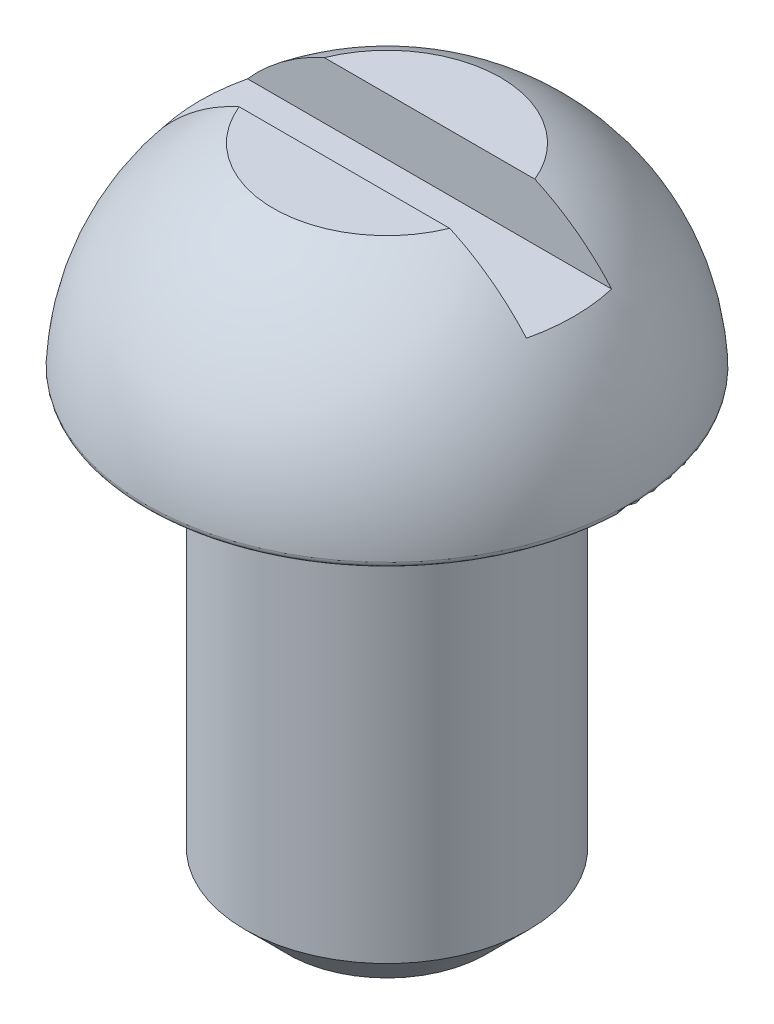
ISO-10303-21;
HEADER;
FILE_DESCRIPTION(('STEP AP214'),'2;1');
FILE_NAME('part.step','',(''),(''),'','','');
FILE_SCHEMA(('AUTOMOTIVE_DESIGN { 1 0 10303 214 1 1 1 1 }'));
ENDSEC;
DATA;
#1=APPLICATION_CONTEXT('core data for automotive mechanical design processes');
#2=APPLICATION_PROTOCOL_DEFINITION('international standard','automotive_design',2000,#1);
#3=PRODUCT_CONTEXT('',#1,'mechanical');
#4=PRODUCT('Part','Part','',(#3));
#5=PRODUCT_RELATED_PRODUCT_CATEGORY('part','',(#4));
#6=PRODUCT_DEFINITION_FORMATION('','',#4);
#7=PRODUCT_DEFINITION_CONTEXT('part definition',#1,'design');
#8=PRODUCT_DEFINITION('design','',#6,#7);
#9=PRODUCT_DEFINITION_SHAPE('','',#8);
#10=(LENGTH_UNIT() NAMED_UNIT(*) SI_UNIT(.MILLI.,.METRE.));
#11=(NAMED_UNIT(*) PLANE_ANGLE_UNIT() SI_UNIT($,.RADIAN.));
#12=(NAMED_UNIT(*) SI_UNIT($,.STERADIAN.) SOLID_ANGLE_UNIT());
#13=UNCERTAINTY_MEASURE_WITH_UNIT(LENGTH_MEASURE(1.E-05),#10,'distance_accuracy_value','');
#14=(GEOMETRIC_REPRESENTATION_CONTEXT(3) GLOBAL_UNCERTAINTY_ASSIGNED_CONTEXT((#13)) GLOBAL_UNIT_ASSIGNED_CONTEXT((#10,
#11,#12)) REPRESENTATION_CONTEXT('',''));
#15=CARTESIAN_POINT('',(0.,0.,0.));
#16=DIRECTION('',(0.,0.,1.));
#17=DIRECTION('',(1.,0.,0.));
#18=AXIS2_PLACEMENT_3D('',#15,#16,#17);
#19=CARTESIAN_POINT('',(0.,11.5,0.));
#20=DIRECTION('',(0.,1.,0.));
#21=DIRECTION('',(0.,0.,1.));
#22=AXIS2_PLACEMENT_3D('',#19,#20,#21);
#23=PLANE('',#22);
#24=DIRECTION('',(-1.,0.,0.));
#25=VECTOR('',#24,1.);
#26=CARTESIAN_POINT('',(-4.,11.5,-0.75));
#27=LINE('',#26,#25);
#28=CARTESIAN_POINT('',(1.85404962177392,11.5,-0.75));
#29=VERTEX_POINT('',#28);
#30=CARTESIAN_POINT('',(-1.85404962177392,11.5,-0.75));
#31=VERTEX_POINT('',#30);
#32=EDGE_CURVE('E85',#29,#31,#27,.T.);
#33=ORIENTED_EDGE('',*,*,#32,.F.);
#34=CARTESIAN_POINT('',(0.,11.5,0.));
#35=DIRECTION('',(0.,-1.,0.));
#36=DIRECTION('',(0.,0.,-1.));
#37=AXIS2_PLACEMENT_3D('',#34,#35,#36);
#38=CIRCLE('',#37,2.);
#39=EDGE_CURVE('E92',#31,#29,#38,.T.);
#40=ORIENTED_EDGE('',*,*,#39,.F.);
#41=EDGE_LOOP('',(#33,#40));
#42=FACE_BOUND('',#41,.T.);
#43=ADVANCED_FACE('F31',(#42),#23,.T.);
#44=CARTESIAN_POINT('',(1.75,0.,0.));
#45=DIRECTION('',(0.,-1.,0.));
#46=DIRECTION('',(0.,0.,-1.));
#47=AXIS2_PLACEMENT_3D('',#44,#45,#46);
#48=PLANE('',#47);
#49=CARTESIAN_POINT('',(0.,0.,0.));
#50=DIRECTION('',(0.,-1.,0.));
#51=DIRECTION('',(0.,0.,-1.));
#52=AXIS2_PLACEMENT_3D('',#49,#50,#51);
#53=CIRCLE('',#52,1.75);
#54=CARTESIAN_POINT('',(0.,0.,-1.75));
#55=VERTEX_POINT('',#54);
#56=EDGE_CURVE('E190',#55,#55,#53,.T.);
#57=ORIENTED_EDGE('',*,*,#56,.T.);
#58=EDGE_LOOP('',(#57));
#59=FACE_BOUND('',#58,.T.);
#60=ADVANCED_FACE('F33',(#59),#48,.T.);
#61=DIRECTION('',(1.,0.,0.));
#62=VECTOR('',#61,1.);
#63=CARTESIAN_POINT('',(-4.,11.5,0.750000000000001));
#64=LINE('',#63,#62);
#65=CARTESIAN_POINT('',(-1.85404962177392,11.5,0.75));
#66=VERTEX_POINT('',#65);
#67=CARTESIAN_POINT('',(1.85404962177392,11.5,0.75));
#68=VERTEX_POINT('',#67);
#69=EDGE_CURVE('E76',#66,#68,#64,.T.);
#70=ORIENTED_EDGE('',*,*,#69,.F.);
#71=EDGE_CURVE('E84',#68,#66,#38,.T.);
#72=ORIENTED_EDGE('',*,*,#71,.F.);
#73=EDGE_LOOP('',(#70,#72));
#74=FACE_BOUND('',#73,.T.);
#75=ADVANCED_FACE('F83',(#74),#23,.T.);
#76=CARTESIAN_POINT('',(0.,7.90254895572012,0.));
#77=DIRECTION('',(0.,-1.,0.));
#78=DIRECTION('',(0.,0.,-1.));
#79=AXIS2_PLACEMENT_3D('',#76,#77,#78);
#80=DEGENERATE_TOROIDAL_SURFACE('',#79,0.251187264453516,4.,.T.);
#81=CARTESIAN_POINT('',(0.,11.8713253231735,-0.75));
#82=CARTESIAN_POINT('',(-0.0629220390886012,11.8713254213378,-0.75));
#83=CARTESIAN_POINT('',(-0.125844467781649,11.8703374468603,-0.75));
#84=CARTESIAN_POINT('',(-0.251619483946908,11.8662956578809,-0.75));
#85=CARTESIAN_POINT('',(-0.314472072160981,11.8632418655369,-0.75));
#86=CARTESIAN_POINT('',(-0.502918858461382,11.8506387891646,-0.75));
#87=CARTESIAN_POINT('',(-0.628314596643319,11.8376472734626,-0.75));
#88=CARTESIAN_POINT('',(-0.869884431273301,11.8021927933833,-0.75));
#89=CARTESIAN_POINT('',(-0.986150684308809,11.7803627004585,-0.75));
#90=CARTESIAN_POINT('',(-1.21645990898877,11.7269196245079,-0.75));
#91=CARTESIAN_POINT('',(-1.33050229164678,11.6953040862557,-0.75));
#92=CARTESIAN_POINT('',(-1.55547287393435,11.6222320704912,-0.75));
#93=CARTESIAN_POINT('',(-1.6663990913075,11.5807694807947,-0.75));
#94=CARTESIAN_POINT('',(-1.88419647938333,11.4881868164881,-0.75));
#95=CARTESIAN_POINT('',(-1.99106618245551,11.4370632858373,-0.75));
#96=CARTESIAN_POINT('',(-2.19763665776107,11.3266772445949,-0.75));
#97=CARTESIAN_POINT('',(-2.29744086526932,11.2676082643384,-0.75));
#98=CARTESIAN_POINT('',(-2.49153541034022,11.1409398253045,-0.75));
#99=CARTESIAN_POINT('',(-2.58582359240153,11.0733370639324,-0.75));
#100=CARTESIAN_POINT('',(-2.7680690910925,10.9301403902095,-0.75));
#101=CARTESIAN_POINT('',(-2.85602908815232,10.8545498951203,-0.75));
#102=CARTESIAN_POINT('',(-3.02498268485799,10.695931842077,-0.75));
#103=CARTESIAN_POINT('',(-3.10597371602768,10.6129015649429,-0.75));
#104=CARTESIAN_POINT('',(-3.33143210845437,10.3603614140614,-0.75));
#105=CARTESIAN_POINT('',(-3.46574464429,10.1815688741806,-0.75));
#106=CARTESIAN_POINT('',(-3.70218252479334,9.80400901398985,-0.75));
#107=CARTESIAN_POINT('',(-3.80431386039929,9.60524542064207,-0.75));
#108=CARTESIAN_POINT('',(-3.97319355372104,9.19425572314944,-0.75));
#109=CARTESIAN_POINT('',(-4.0401021375461,8.9820955861659,-0.75));
#110=CARTESIAN_POINT('',(-4.13730574145651,8.54954424330069,-0.75));
#111=CARTESIAN_POINT('',(-4.16759935711677,8.32915272202548,-0.75));
#112=CARTESIAN_POINT('',(-4.19069515207767,7.88665882197309,-0.75));
#113=CARTESIAN_POINT('',(-4.18353898974582,7.6645586185079,-0.75));
#114=CARTESIAN_POINT('',(-4.13203662682793,7.22471647603452,-0.75));
#115=CARTESIAN_POINT('',(-4.08769068622575,7.00697450656997,-0.75));
#116=CARTESIAN_POINT('',(-3.96307377974643,6.58204274703518,-0.75));
#117=CARTESIAN_POINT('',(-3.88280649605123,6.37485187782938,-0.75));
#118=CARTESIAN_POINT('',(-3.68867736949314,5.9769076688291,-0.75));
#119=CARTESIAN_POINT('',(-3.57481747195615,5.78615337802955,-0.75));
#120=CARTESIAN_POINT('',(-3.31657081872274,5.42627346359334,-0.75));
#121=CARTESIAN_POINT('',(-3.17216904612608,5.25715854554567,-0.75));
#122=CARTESIAN_POINT('',(-2.93601924886324,5.02351332143022,-0.75));
#123=CARTESIAN_POINT('',(-2.85398221458269,4.94892545603554,-0.75));
#124=CARTESIAN_POINT('',(-2.68394810384282,4.80690184949098,-0.75));
#125=CARTESIAN_POINT('',(-2.59595319203265,4.73946353333475,-0.75));
#126=CARTESIAN_POINT('',(-2.41433368923245,4.61199276166022,-0.75));
#127=CARTESIAN_POINT('',(-2.32069166082743,4.55198519673803,-0.75));
#128=CARTESIAN_POINT('',(-2.12874390081305,4.44004320274453,-0.75));
#129=CARTESIAN_POINT('',(-2.0304398290893,4.38810592805728,-0.75));
#130=CARTESIAN_POINT('',(-1.82995802317233,4.2926537500461,-0.75));
#131=CARTESIAN_POINT('',(-1.72778462116709,4.24912974206796,-0.75));
#132=CARTESIAN_POINT('',(-1.52023329889945,4.17066887724191,-0.75));
#133=CARTESIAN_POINT('',(-1.41485641920221,4.13572926477363,-0.75));
#134=CARTESIAN_POINT('',(-1.20054653502591,4.0741975045066,-0.75));
#135=CARTESIAN_POINT('',(-1.09158838507219,4.04769309162907,-0.75));
#136=CARTESIAN_POINT('',(-0.871943248689851,4.00338521032545,-0.75));
#137=CARTESIAN_POINT('',(-0.761256445375321,3.98558082668133,-0.75));
#138=CARTESIAN_POINT('',(-0.538546587546819,3.95806859383276,-0.75));
#139=CARTESIAN_POINT('',(-0.426520440227824,3.94838619402209,-0.75));
#140=CARTESIAN_POINT('',(-0.258194158556274,3.93914793915042,-0.75));
#141=CARTESIAN_POINT('',(-0.202019189981143,3.93694955766882,-0.75));
#142=CARTESIAN_POINT('',(-0.089629280719298,3.9341765918778,-0.75));
#143=CARTESIAN_POINT('',(-0.0334143413581236,3.93360195602258,-0.75));
#144=CARTESIAN_POINT('',(0.0895703381347293,3.93407056708453,-0.75));
#145=CARTESIAN_POINT('',(0.156339023293247,3.9354380251739,-0.75));
#146=CARTESIAN_POINT('',(0.289786823027109,3.94053883249711,-0.75));
#147=CARTESIAN_POINT('',(0.356465939241009,3.94427213784326,-0.75));
#148=CARTESIAN_POINT('',(0.489601645075183,3.95436469770027,-0.75));
#149=CARTESIAN_POINT('',(0.556058317748402,3.96072282720604,-0.75));
#150=CARTESIAN_POINT('',(0.68863438467302,3.97628855319762,-0.75));
#151=CARTESIAN_POINT('',(0.754753776904647,3.98549616672698,-0.75));
#152=CARTESIAN_POINT('',(0.951981100661975,4.01757626217259,-0.75));
#153=CARTESIAN_POINT('',(1.08239697789367,4.04493679870434,-0.75));
#154=CARTESIAN_POINT('',(1.33999759950547,4.11213097122829,-0.75));
#155=CARTESIAN_POINT('',(1.46718176548068,4.15196682326141,-0.75));
#156=CARTESIAN_POINT('',(1.71387869519374,4.24285666478502,-0.75));
#157=CARTESIAN_POINT('',(1.83350374454183,4.29360539741071,-0.75));
#158=CARTESIAN_POINT('',(2.06724369377024,4.4065047804184,-0.75));
#159=CARTESIAN_POINT('',(2.18135873591225,4.46865513622527,-0.75));
#160=CARTESIAN_POINT('',(2.40313784057959,4.60394177082253,-0.75));
#161=CARTESIAN_POINT('',(2.51079154052084,4.67709507024297,-0.75));
#162=CARTESIAN_POINT('',(2.71834946723273,4.83359515066767,-0.75));
#163=CARTESIAN_POINT('',(2.81825469564505,4.91694061053436,-0.75));
#164=CARTESIAN_POINT('',(3.07844234976517,5.1567818148287,-0.75));
#165=CARTESIAN_POINT('',(3.23025767468538,5.32265641437973,-0.75));
#166=CARTESIAN_POINT('',(3.5033601946328,5.67750241905313,-0.75));
#167=CARTESIAN_POINT('',(3.62467695528908,5.86645118969516,-0.750000000000001));
#168=CARTESIAN_POINT('',(3.83263269671526,6.26047409624548,-0.750000000000001));
#169=CARTESIAN_POINT('',(3.91956385703199,6.46539383941384,-0.750000000000001));
#170=CARTESIAN_POINT('',(4.0577395883791,6.88697054825718,-0.750000000000001));
#171=CARTESIAN_POINT('',(4.10897748310089,7.10362970158661,-0.750000000000001));
#172=CARTESIAN_POINT('',(4.17422265872735,7.54210881083407,-0.750000000000001));
#173=CARTESIAN_POINT('',(4.18829264552823,7.76391943692915,-0.750000000000001));
#174=CARTESIAN_POINT('',(4.17897916787922,8.20674832446059,-0.750000000000001));
#175=CARTESIAN_POINT('',(4.15559659045676,8.42776660453865,-0.750000000000001));
#176=CARTESIAN_POINT('',(4.07206283828415,8.86267082829224,-0.750000000000001));
#177=CARTESIAN_POINT('',(4.01192268581079,9.07655888979661,-0.750000000000001));
#178=CARTESIAN_POINT('',(3.85659607902625,9.49119914686961,-0.750000000000001));
#179=CARTESIAN_POINT('',(3.76141172880569,9.6919521302301,-0.750000000000001));
#180=CARTESIAN_POINT('',(3.53871279537206,10.0746900669347,-0.750000000000001));
#181=CARTESIAN_POINT('',(3.41118817548028,10.2566691691665,-0.75));
#182=CARTESIAN_POINT('',(3.12731814091474,10.5967721515395,-0.75));
#183=CARTESIAN_POINT('',(2.97096759896837,10.7548917786782,-0.750000000000001));
#184=CARTESIAN_POINT('',(2.71830594289221,10.97080228372,-0.75));
#185=CARTESIAN_POINT('',(2.6309277740663,11.0393084942463,-0.75));
#186=CARTESIAN_POINT('',(2.45074238373382,11.168745130094,-0.75));
#187=CARTESIAN_POINT('',(2.35793712481219,11.2296782694367,-0.75));
#188=CARTESIAN_POINT('',(2.1675677834584,11.343557218428,-0.75));
#189=CARTESIAN_POINT('',(2.07000403410402,11.3965035860641,-0.75));
#190=CARTESIAN_POINT('',(1.87084215744287,11.4940753895157,-0.75));
#191=CARTESIAN_POINT('',(1.76924542615833,11.5387036747013,-0.75));
#192=CARTESIAN_POINT('',(1.56195371290642,11.6197215068276,-0.75));
#193=CARTESIAN_POINT('',(1.45623396355732,11.6560476303505,-0.75));
#194=CARTESIAN_POINT('',(1.24221239842266,11.719915488697,-0.75));
#195=CARTESIAN_POINT('',(1.13391134592798,11.7474597865035,-0.75));
#196=CARTESIAN_POINT('',(0.915531306850148,11.7938641658016,-0.75));
#197=CARTESIAN_POINT('',(0.805453199909168,11.8127284152648,-0.75));
#198=CARTESIAN_POINT('',(0.584239227879711,11.8422672663623,-0.75));
#199=CARTESIAN_POINT('',(0.473103559335943,11.8529433607682,-0.75));
#200=CARTESIAN_POINT('',(0.301534200611886,11.8639021013191,-0.75));
#201=CARTESIAN_POINT('',(0.241243654966936,11.8667061035804,-0.75));
#202=CARTESIAN_POINT('',(0.12063550406229,11.870417155203,-0.75));
#203=CARTESIAN_POINT('',(0.0603179310427579,11.8713252290718,-0.75));
#204=CARTESIAN_POINT('',(0.,11.8713253231735,-0.75));
#205=B_SPLINE_CURVE_WITH_KNOTS('',3,(#81,#82,#83,#84,#85,#86,#87,#88,#89,#90,#91,#92,#93,#94,
#95,#96,#97,#98,#99,#100,#101,#102,#103,#104,#105,#106,#107,#108,#109,#110,#111,#112,#113,#114,
#115,#116,#117,#118,#119,#120,#121,#122,#123,#124,#125,#126,#127,#128,#129,#130,#131,#132,#133,
#134,#135,#136,#137,#138,#139,#140,#141,#142,#143,#144,#145,#146,#147,#148,#149,#150,#151,#152,
#153,#154,#155,#156,#157,#158,#159,#160,#161,#162,#163,#164,#165,#166,#167,#168,#169,#170,#171,
#172,#173,#174,#175,#176,#177,#178,#179,#180,#181,#182,#183,#184,#185,#186,#187,#188,#189,#190,
#191,#192,#193,#194,#195,#196,#197,#198,#199,#200,#201,#202,#203,#204),.UNSPECIFIED.,.T.,.F.,(4,
2,2,2,2,2,2,2,2,2,2,2,2,2,2,2,2,2,2,2,2,2,2,2,2,2,2,2,2,2,2,2,2,2,2,2,2,2,2,2,2,2,2,2,2,2,2,2,2,
2,2,2,2,2,2,2,2,2,2,2,2,4),(0.,0.188756294687437,0.377510564821113,0.755280997491542,
1.10977622931116,1.46436410697405,1.81917265954468,2.174108380069,2.52158816349091,
2.86920283711227,3.21666939393033,3.56426346905097,4.23165319589308,4.89891860617539,
5.56312185026573,6.2273505701151,6.89084057267821,7.5543259369976,8.21774330512855,
8.88112226273996,9.54482815347266,9.87713428134949,10.20932031517,10.5425905787883,
10.875743062033,11.2085329713489,11.541215913981,11.8772538585757,12.2132564453317,
12.550307969775,12.7189437464545,12.8875741697316,13.0878831385615,13.2881883916656,
13.488407882506,13.688628570937,14.087755045107,14.4869524579857,14.876172775606,
15.2653830386506,15.6552016901302,16.0449698656331,16.7160597555839,17.3864965532814,
18.051107440301,18.7158426072585,19.3794555826048,20.0430528411576,20.7064512082832,
21.3698097507647,22.0333744165032,22.6970572246923,23.0298308802171,23.3624849310183,
23.6951157305166,24.0276323766348,24.3626101283002,24.6974900267561,25.0322089548769,
25.3668668463163,25.5479090789648,25.7288534560345),.UNSPECIFIED.);
#206=CARTESIAN_POINT('',(-3.20655950030948,10.5,-0.75));
#207=VERTEX_POINT('',#206);
#208=EDGE_CURVE('E11',#31,#207,#205,.T.);
#209=ORIENTED_EDGE('',*,*,#208,.F.);
#210=ORIENTED_EDGE('',*,*,#39,.T.);
#211=CARTESIAN_POINT('',(3.20655950030948,10.5,-0.75));
#212=VERTEX_POINT('',#211);
#213=EDGE_CURVE('E35',#212,#29,#205,.T.);
#214=ORIENTED_EDGE('',*,*,#213,.F.);
#215=CARTESIAN_POINT('',(0.,10.5,0.));
#216=DIRECTION('',(0.,1.,0.));
#217=DIRECTION('',(0.,0.,1.));
#218=AXIS2_PLACEMENT_3D('',#215,#216,#217);
#219=CIRCLE('',#218,3.29310246257613);
#220=CARTESIAN_POINT('',(3.20655950030948,10.5,0.75));
#221=VERTEX_POINT('',#220);
#222=EDGE_CURVE('E104',#212,#221,#219,.F.);
#223=ORIENTED_EDGE('',*,*,#222,.T.);
#224=CARTESIAN_POINT('',(0.,11.8713253231735,0.75));
#225=CARTESIAN_POINT('',(0.0629220390886012,11.8713254213378,0.75));
#226=CARTESIAN_POINT('',(0.125844467781649,11.8703374468603,0.75));
#227=CARTESIAN_POINT('',(0.251619483946908,11.8662956578809,0.75));
#228=CARTESIAN_POINT('',(0.314472072160981,11.8632418655369,0.75));
#229=CARTESIAN_POINT('',(0.502918858461382,11.8506387891646,0.75));
#230=CARTESIAN_POINT('',(0.628314596643319,11.8376472734626,0.75));
#231=CARTESIAN_POINT('',(0.869884431273301,11.8021927933833,0.75));
#232=CARTESIAN_POINT('',(0.986150684308809,11.7803627004585,0.75));
#233=CARTESIAN_POINT('',(1.21645990898877,11.7269196245079,0.75));
#234=CARTESIAN_POINT('',(1.33050229164678,11.6953040862557,0.75));
#235=CARTESIAN_POINT('',(1.55547287393435,11.6222320704912,0.75));
#236=CARTESIAN_POINT('',(1.6663990913075,11.5807694807947,0.75));
#237=CARTESIAN_POINT('',(1.88419647938333,11.4881868164881,0.75));
#238=CARTESIAN_POINT('',(1.99106618245551,11.4370632858373,0.75));
#239=CARTESIAN_POINT('',(2.19763665776107,11.3266772445949,0.75));
#240=CARTESIAN_POINT('',(2.29744086526932,11.2676082643384,0.75));
#241=CARTESIAN_POINT('',(2.49153541034022,11.1409398253045,0.75));
#242=CARTESIAN_POINT('',(2.58582359240153,11.0733370639324,0.75));
#243=CARTESIAN_POINT('',(2.7680690910925,10.9301403902095,0.75));
#244=CARTESIAN_POINT('',(2.85602908815232,10.8545498951203,0.75));
#245=CARTESIAN_POINT('',(3.02498268485799,10.695931842077,0.75));
#246=CARTESIAN_POINT('',(3.10597371602768,10.6129015649429,0.75));
#247=CARTESIAN_POINT('',(3.33143210845437,10.3603614140614,0.75));
#248=CARTESIAN_POINT('',(3.46574464429,10.1815688741806,0.75));
#249=CARTESIAN_POINT('',(3.70218252479334,9.80400901398985,0.75));
#250=CARTESIAN_POINT('',(3.80431386039929,9.60524542064207,0.749999999999999));
#251=CARTESIAN_POINT('',(3.97319355372104,9.19425572314944,0.749999999999999));
#252=CARTESIAN_POINT('',(4.0401021375461,8.9820955861659,0.749999999999999));
#253=CARTESIAN_POINT('',(4.13730574145651,8.54954424330069,0.749999999999999));
#254=CARTESIAN_POINT('',(4.16759935711677,8.32915272202548,0.749999999999999));
#255=CARTESIAN_POINT('',(4.19069515207767,7.88665882197309,0.749999999999999));
#256=CARTESIAN_POINT('',(4.18353898974582,7.6645586185079,0.749999999999999));
#257=CARTESIAN_POINT('',(4.13203662682793,7.22471647603452,0.749999999999999));
#258=CARTESIAN_POINT('',(4.08769068622575,7.00697450656997,0.749999999999999));
#259=CARTESIAN_POINT('',(3.96307377974643,6.58204274703518,0.749999999999999));
#260=CARTESIAN_POINT('',(3.88280649605123,6.37485187782938,0.749999999999999));
#261=CARTESIAN_POINT('',(3.68867736949314,5.9769076688291,0.749999999999999));
#262=CARTESIAN_POINT('',(3.57481747195615,5.78615337802955,0.75));
#263=CARTESIAN_POINT('',(3.31657081872274,5.42627346359334,0.75));
#264=CARTESIAN_POINT('',(3.17216904612608,5.25715854554567,0.749999999999999));
#265=CARTESIAN_POINT('',(2.93601924886324,5.02351332143022,0.75));
#266=CARTESIAN_POINT('',(2.85398221458269,4.94892545603554,0.75));
#267=CARTESIAN_POINT('',(2.68394810384282,4.80690184949098,0.75));
#268=CARTESIAN_POINT('',(2.59595319203265,4.73946353333475,0.75));
#269=CARTESIAN_POINT('',(2.41433368923245,4.61199276166022,0.75));
#270=CARTESIAN_POINT('',(2.32069166082743,4.55198519673803,0.75));
#271=CARTESIAN_POINT('',(2.12874390081305,4.44004320274453,0.75));
#272=CARTESIAN_POINT('',(2.0304398290893,4.38810592805728,0.75));
#273=CARTESIAN_POINT('',(1.82995802317233,4.2926537500461,0.75));
#274=CARTESIAN_POINT('',(1.72778462116709,4.24912974206796,0.75));
#275=CARTESIAN_POINT('',(1.52023329889945,4.17066887724191,0.75));
#276=CARTESIAN_POINT('',(1.41485641920221,4.13572926477363,0.75));
#277=CARTESIAN_POINT('',(1.20054653502591,4.0741975045066,0.75));
#278=CARTESIAN_POINT('',(1.09158838507219,4.04769309162907,0.75));
#279=CARTESIAN_POINT('',(0.871943248689851,4.00338521032545,0.75));
#280=CARTESIAN_POINT('',(0.761256445375321,3.98558082668133,0.75));
#281=CARTESIAN_POINT('',(0.538546587546819,3.95806859383276,0.75));
#282=CARTESIAN_POINT('',(0.426520440227824,3.94838619402209,0.75));
#283=CARTESIAN_POINT('',(0.258194158556274,3.93914793915042,0.75));
#284=CARTESIAN_POINT('',(0.202019189981143,3.93694955766882,0.75));
#285=CARTESIAN_POINT('',(0.089629280719298,3.9341765918778,0.75));
#286=CARTESIAN_POINT('',(0.0334143413581236,3.93360195602258,0.75));
#287=CARTESIAN_POINT('',(-0.0895703381347293,3.93407056708453,0.75));
#288=CARTESIAN_POINT('',(-0.156339023293247,3.9354380251739,0.75));
#289=CARTESIAN_POINT('',(-0.289786823027109,3.94053883249711,0.75));
#290=CARTESIAN_POINT('',(-0.356465939241009,3.94427213784326,0.75));
#291=CARTESIAN_POINT('',(-0.489601645075183,3.95436469770027,0.75));
#292=CARTESIAN_POINT('',(-0.556058317748402,3.96072282720604,0.75));
#293=CARTESIAN_POINT('',(-0.68863438467302,3.97628855319762,0.75));
#294=CARTESIAN_POINT('',(-0.754753776904647,3.98549616672698,0.75));
#295=CARTESIAN_POINT('',(-0.951981100661975,4.01757626217259,0.75));
#296=CARTESIAN_POINT('',(-1.08239697789367,4.04493679870434,0.75));
#297=CARTESIAN_POINT('',(-1.33999759950547,4.11213097122829,0.75));
#298=CARTESIAN_POINT('',(-1.46718176548068,4.15196682326141,0.75));
#299=CARTESIAN_POINT('',(-1.71387869519374,4.24285666478502,0.75));
#300=CARTESIAN_POINT('',(-1.83350374454183,4.29360539741071,0.75));
#301=CARTESIAN_POINT('',(-2.06724369377024,4.4065047804184,0.75));
#302=CARTESIAN_POINT('',(-2.18135873591225,4.46865513622527,0.75));
#303=CARTESIAN_POINT('',(-2.40313784057959,4.60394177082253,0.75));
#304=CARTESIAN_POINT('',(-2.51079154052084,4.67709507024297,0.75));
#305=CARTESIAN_POINT('',(-2.71834946723273,4.83359515066767,0.75));
#306=CARTESIAN_POINT('',(-2.81825469564505,4.91694061053436,0.75));
#307=CARTESIAN_POINT('',(-3.07844234976517,5.1567818148287,0.75));
#308=CARTESIAN_POINT('',(-3.23025767468538,5.32265641437973,0.75));
#309=CARTESIAN_POINT('',(-3.5033601946328,5.67750241905313,0.75));
#310=CARTESIAN_POINT('',(-3.62467695528908,5.86645118969516,0.750000000000001));
#311=CARTESIAN_POINT('',(-3.83263269671526,6.26047409624548,0.750000000000001));
#312=CARTESIAN_POINT('',(-3.91956385703199,6.46539383941384,0.750000000000001));
#313=CARTESIAN_POINT('',(-4.0577395883791,6.88697054825718,0.750000000000001));
#314=CARTESIAN_POINT('',(-4.10897748310089,7.10362970158661,0.750000000000001));
#315=CARTESIAN_POINT('',(-4.17422265872735,7.54210881083407,0.750000000000001));
#316=CARTESIAN_POINT('',(-4.18829264552823,7.76391943692915,0.750000000000001));
#317=CARTESIAN_POINT('',(-4.17897916787922,8.20674832446059,0.750000000000001));
#318=CARTESIAN_POINT('',(-4.15559659045676,8.42776660453865,0.750000000000001));
#319=CARTESIAN_POINT('',(-4.07206283828415,8.86267082829224,0.750000000000001));
#320=CARTESIAN_POINT('',(-4.01192268581079,9.07655888979661,0.750000000000001));
#321=CARTESIAN_POINT('',(-3.85659607902625,9.49119914686961,0.750000000000001));
#322=CARTESIAN_POINT('',(-3.76141172880569,9.6919521302301,0.750000000000001));
#323=CARTESIAN_POINT('',(-3.53871279537206,10.0746900669347,0.750000000000001));
#324=CARTESIAN_POINT('',(-3.41118817548028,10.2566691691665,0.75));
#325=CARTESIAN_POINT('',(-3.12731814091474,10.5967721515395,0.75));
#326=CARTESIAN_POINT('',(-2.97096759896837,10.7548917786782,0.750000000000001));
#327=CARTESIAN_POINT('',(-2.71830594289221,10.97080228372,0.75));
#328=CARTESIAN_POINT('',(-2.6309277740663,11.0393084942463,0.75));
#329=CARTESIAN_POINT('',(-2.45074238373382,11.168745130094,0.75));
#330=CARTESIAN_POINT('',(-2.35793712481219,11.2296782694367,0.75));
#331=CARTESIAN_POINT('',(-2.1675677834584,11.343557218428,0.75));
#332=CARTESIAN_POINT('',(-2.07000403410402,11.3965035860641,0.75));
#333=CARTESIAN_POINT('',(-1.87084215744287,11.4940753895157,0.75));
#334=CARTESIAN_POINT('',(-1.76924542615833,11.5387036747013,0.75));
#335=CARTESIAN_POINT('',(-1.56195371290642,11.6197215068276,0.75));
#336=CARTESIAN_POINT('',(-1.45623396355732,11.6560476303505,0.75));
#337=CARTESIAN_POINT('',(-1.24221239842266,11.719915488697,0.75));
#338=CARTESIAN_POINT('',(-1.13391134592798,11.7474597865035,0.75));
#339=CARTESIAN_POINT('',(-0.915531306850148,11.7938641658016,0.75));
#340=CARTESIAN_POINT('',(-0.805453199909168,11.8127284152648,0.75));
#341=CARTESIAN_POINT('',(-0.584239227879711,11.8422672663623,0.75));
#342=CARTESIAN_POINT('',(-0.473103559335943,11.8529433607682,0.75));
#343=CARTESIAN_POINT('',(-0.301534200611886,11.8639021013191,0.75));
#344=CARTESIAN_POINT('',(-0.241243654966936,11.8667061035804,0.75));
#345=CARTESIAN_POINT('',(-0.12063550406229,11.870417155203,0.75));
#346=CARTESIAN_POINT('',(-0.0603179310427579,11.8713252290718,0.75));
#347=CARTESIAN_POINT('',(0.,11.8713253231735,0.75));
#348=B_SPLINE_CURVE_WITH_KNOTS('',3,(#224,#225,#226,#227,#228,#229,#230,#231,#232,#233,#234,
#235,#236,#237,#238,#239,#240,#241,#242,#243,#244,#245,#246,#247,#248,#249,#250,#251,#252,#253,
#254,#255,#256,#257,#258,#259,#260,#261,#262,#263,#264,#265,#266,#267,#268,#269,#270,#271,#272,
#273,#274,#275,#276,#277,#278,#279,#280,#281,#282,#283,#284,#285,#286,#287,#288,#289,#290,#291,
#292,#293,#294,#295,#296,#297,#298,#299,#300,#301,#302,#303,#304,#305,#306,#307,#308,#309,#310,
#311,#312,#313,#314,#315,#316,#317,#318,#319,#320,#321,#322,#323,#324,#325,#326,#327,#328,#329,
#330,#331,#332,#333,#334,#335,#336,#337,#338,#339,#340,#341,#342,#343,#344,#345,#346,#347),
.UNSPECIFIED.,.T.,.F.,(4,2,2,2,2,2,2,2,2,2,2,2,2,2,2,2,2,2,2,2,2,2,2,2,2,2,2,2,2,2,2,2,2,2,2,2,
2,2,2,2,2,2,2,2,2,2,2,2,2,2,2,2,2,2,2,2,2,2,2,2,2,4),(0.,0.188756294687437,0.377510564821113,
0.755280997491542,1.10977622931116,1.46436410697405,1.81917265954468,2.174108380069,
2.52158816349091,2.86920283711227,3.21666939393033,3.56426346905097,4.23165319589308,
4.89891860617539,5.56312185026573,6.2273505701151,6.89084057267821,7.5543259369976,
8.21774330512855,8.88112226273996,9.54482815347266,9.87713428134949,10.20932031517,
10.5425905787883,10.875743062033,11.2085329713489,11.541215913981,11.8772538585757,
12.2132564453317,12.550307969775,12.7189437464545,12.8875741697316,13.0878831385615,
13.2881883916656,13.488407882506,13.688628570937,14.087755045107,14.4869524579857,
14.876172775606,15.2653830386506,15.6552016901302,16.0449698656331,16.7160597555839,
17.3864965532814,18.051107440301,18.7158426072585,19.3794555826048,20.0430528411576,
20.7064512082832,21.3698097507647,22.0333744165032,22.6970572246923,23.0298308802171,
23.3624849310183,23.6951157305166,24.0276323766348,24.3626101283002,24.6974900267561,
25.0322089548769,25.3668668463163,25.5479090789648,25.7288534560345),.UNSPECIFIED.);
#349=EDGE_CURVE('E80',#68,#221,#348,.T.);
#350=ORIENTED_EDGE('',*,*,#349,.F.);
#351=ORIENTED_EDGE('',*,*,#71,.T.);
#352=CARTESIAN_POINT('',(-3.20655950030948,10.5,0.75));
#353=VERTEX_POINT('',#352);
#354=EDGE_CURVE('E44',#353,#66,#348,.T.);
#355=ORIENTED_EDGE('',*,*,#354,.F.);
#356=EDGE_CURVE('E56',#353,#207,#219,.F.);
#357=ORIENTED_EDGE('',*,*,#356,.T.);
#358=EDGE_LOOP('',(#209,#210,#214,#223,#350,#351,#355,#357));
#359=FACE_BOUND('',#358,.T.);
#360=CARTESIAN_POINT('',(0.,8.10506284728923,0.));
#361=DIRECTION('',(0.,-1.,0.));
#362=DIRECTION('',(0.,0.,-1.));
#363=AXIS2_PLACEMENT_3D('',#360,#361,#362);
#364=CIRCLE('',#363,4.24605749059623);
#365=CARTESIAN_POINT('',(0.,8.10506284728923,-4.24605749059623));
#366=VERTEX_POINT('',#365);
#367=EDGE_CURVE('E95',#366,#366,#364,.F.);
#368=ORIENTED_EDGE('',*,*,#367,.T.);
#369=EDGE_LOOP('',(#368));
#370=FACE_BOUND('',#369,.T.);
#371=ADVANCED_FACE('F88',(#359,#370),#80,.T.);
#372=CARTESIAN_POINT('',(4.25,8.,0.));
#373=DIRECTION('',(0.,-1.,0.));
#374=DIRECTION('',(0.,0.,-1.));
#375=AXIS2_PLACEMENT_3D('',#372,#373,#374);
#376=PLANE('',#375);
#377=CARTESIAN_POINT('',(0.,8.,0.));
#378=DIRECTION('',(0.,-1.,0.));
#379=DIRECTION('',(0.,0.,-1.));
#380=AXIS2_PLACEMENT_3D('',#377,#378,#379);
#381=CIRCLE('',#380,4.14618573494266);
#382=CARTESIAN_POINT('',(0.,8.,-4.14618573494266));
#383=VERTEX_POINT('',#382);
#384=EDGE_CURVE('E91',#383,#383,#381,.T.);
#385=ORIENTED_EDGE('',*,*,#384,.T.);
#386=EDGE_LOOP('',(#385));
#387=FACE_BOUND('',#386,.T.);
#388=CARTESIAN_POINT('',(0.,8.,0.));
#389=DIRECTION('',(0.,-1.,0.));
#390=DIRECTION('',(0.,0.,-1.));
#391=AXIS2_PLACEMENT_3D('',#388,#389,#390);
#392=CIRCLE('',#391,2.5);
#393=CARTESIAN_POINT('',(0.,8.,-2.5));
#394=VERTEX_POINT('',#393);
#395=EDGE_CURVE('E98',#394,#394,#392,.T.);
#396=ORIENTED_EDGE('',*,*,#395,.F.);
#397=EDGE_LOOP('',(#396));
#398=FACE_BOUND('',#397,.T.);
#399=ADVANCED_FACE('F127',(#387,#398),#376,.T.);
#400=CARTESIAN_POINT('',(0.,0.,0.));
#401=DIRECTION('',(0.,-1.,0.));
#402=DIRECTION('',(0.,0.,-1.));
#403=AXIS2_PLACEMENT_3D('',#400,#401,#402);
#404=CYLINDRICAL_SURFACE('',#403,2.5);
#405=ORIENTED_EDGE('',*,*,#395,.T.);
#406=EDGE_LOOP('',(#405));
#407=FACE_BOUND('',#406,.T.);
#408=CARTESIAN_POINT('',(0.,0.75,0.));
#409=DIRECTION('',(0.,-1.,0.));
#410=DIRECTION('',(0.,0.,-1.));
#411=AXIS2_PLACEMENT_3D('',#408,#409,#410);
#412=CIRCLE('',#411,2.5);
#413=CARTESIAN_POINT('',(0.,0.75,-2.5));
#414=VERTEX_POINT('',#413);
#415=EDGE_CURVE('E196',#414,#414,#412,.T.);
#416=ORIENTED_EDGE('',*,*,#415,.F.);
#417=EDGE_LOOP('',(#416));
#418=FACE_BOUND('',#417,.T.);
#419=ADVANCED_FACE('F124',(#407,#418),#404,.T.);
#420=CARTESIAN_POINT('',(0.,0.,0.));
#421=DIRECTION('',(0.,1.,0.));
#422=DIRECTION('',(0.,0.,1.));
#423=AXIS2_PLACEMENT_3D('',#420,#421,#422);
#424=CONICAL_SURFACE('',#423,1.75,0.785398163397446);
#425=ORIENTED_EDGE('',*,*,#415,.T.);
#426=EDGE_LOOP('',(#425));
#427=FACE_BOUND('',#426,.T.);
#428=ORIENTED_EDGE('',*,*,#56,.F.);
#429=EDGE_LOOP('',(#428));
#430=FACE_BOUND('',#429,.T.);
#431=ADVANCED_FACE('F120',(#427,#430),#424,.T.);
#432=CARTESIAN_POINT('',(0.,8.1,0.));
#433=DIRECTION('',(0.,-1.,0.));
#434=DIRECTION('',(0.,0.,-1.));
#435=AXIS2_PLACEMENT_3D('',#432,#433,#434);
#436=TOROIDAL_SURFACE('',#435,4.14618573494266,0.1);
#437=ORIENTED_EDGE('',*,*,#367,.F.);
#438=EDGE_LOOP('',(#437));
#439=FACE_BOUND('',#438,.T.);
#440=ORIENTED_EDGE('',*,*,#384,.F.);
#441=EDGE_LOOP('',(#440));
#442=FACE_BOUND('',#441,.T.);
#443=ADVANCED_FACE('F117',(#439,#442),#436,.T.);
#444=CARTESIAN_POINT('',(-4.,10.5,-0.75));
#445=DIRECTION('',(0.,0.,-1.));
#446=DIRECTION('',(-1.,0.,0.));
#447=AXIS2_PLACEMENT_3D('',#444,#445,#446);
#448=PLANE('',#447);
#449=ORIENTED_EDGE('',*,*,#208,.T.);
#450=DIRECTION('',(-1.,0.,0.));
#451=VECTOR('',#450,1.);
#452=CARTESIAN_POINT('',(-4.,10.5,-0.75));
#453=LINE('',#452,#451);
#454=EDGE_CURVE('E187',#212,#207,#453,.T.);
#455=ORIENTED_EDGE('',*,*,#454,.F.);
#456=ORIENTED_EDGE('',*,*,#213,.T.);
#457=ORIENTED_EDGE('',*,*,#32,.T.);
#458=EDGE_LOOP('',(#449,#455,#456,#457));
#459=FACE_BOUND('',#458,.T.);
#460=ADVANCED_FACE('F114',(#459),#448,.F.);
#461=CARTESIAN_POINT('',(-4.,10.5,0.750000000000001));
#462=DIRECTION('',(0.,0.,1.));
#463=DIRECTION('',(1.,0.,0.));
#464=AXIS2_PLACEMENT_3D('',#461,#462,#463);
#465=PLANE('',#464);
#466=ORIENTED_EDGE('',*,*,#349,.T.);
#467=DIRECTION('',(1.,0.,0.));
#468=VECTOR('',#467,1.);
#469=CARTESIAN_POINT('',(-4.,10.5,0.750000000000001));
#470=LINE('',#469,#468);
#471=EDGE_CURVE('E51',#353,#221,#470,.T.);
#472=ORIENTED_EDGE('',*,*,#471,.F.);
#473=ORIENTED_EDGE('',*,*,#354,.T.);
#474=ORIENTED_EDGE('',*,*,#69,.T.);
#475=EDGE_LOOP('',(#466,#472,#473,#474));
#476=FACE_BOUND('',#475,.T.);
#477=ADVANCED_FACE('F75',(#476),#465,.F.);
#478=CARTESIAN_POINT('',(-4.,10.5,-0.75));
#479=DIRECTION('',(0.,1.,0.));
#480=DIRECTION('',(0.,0.,1.));
#481=AXIS2_PLACEMENT_3D('',#478,#479,#480);
#482=PLANE('',#481);
#483=ORIENTED_EDGE('',*,*,#471,.T.);
#484=ORIENTED_EDGE('',*,*,#222,.F.);
#485=ORIENTED_EDGE('',*,*,#454,.T.);
#486=ORIENTED_EDGE('',*,*,#356,.F.);
#487=EDGE_LOOP('',(#483,#484,#485,#486));
#488=FACE_BOUND('',#487,.T.);
#489=ADVANCED_FACE('F113',(#488),#482,.T.);
#490=CLOSED_SHELL('',(#43,#60,#75,#371,#399,#419,#431,#443,#460,#477,#489));
#491=MANIFOLD_SOLID_BREP('B2',#490);
#492=ADVANCED_BREP_SHAPE_REPRESENTATION('',(#18,#491),#14);
#493=SHAPE_DEFINITION_REPRESENTATION(#9,#492);
ENDSEC;
END-ISO-10303-21;
